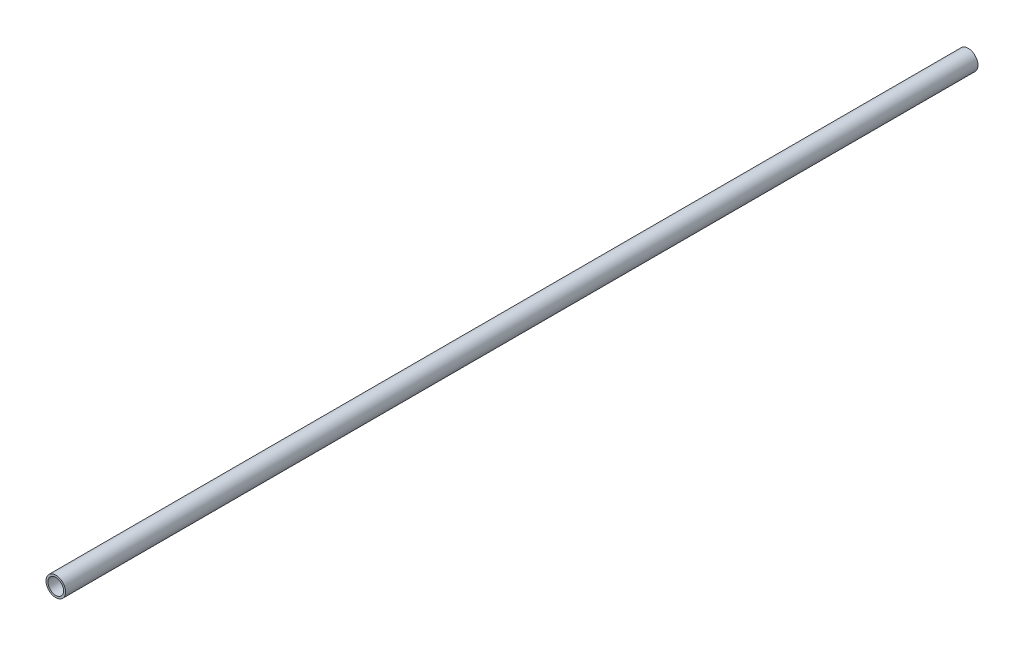
ISO-10303-21;
HEADER;
FILE_DESCRIPTION(('STEP AP214'),'2;1');
FILE_NAME('part.step','',(''),(''),'','','');
FILE_SCHEMA(('AUTOMOTIVE_DESIGN { 1 0 10303 214 1 1 1 1 }'));
ENDSEC;
DATA;
#1=APPLICATION_CONTEXT('core data for automotive mechanical design processes');
#2=APPLICATION_PROTOCOL_DEFINITION('international standard','automotive_design',2000,#1);
#3=PRODUCT_CONTEXT('',#1,'mechanical');
#4=PRODUCT('Part','Part','',(#3));
#5=PRODUCT_RELATED_PRODUCT_CATEGORY('part','',(#4));
#6=PRODUCT_DEFINITION_FORMATION('','',#4);
#7=PRODUCT_DEFINITION_CONTEXT('part definition',#1,'design');
#8=PRODUCT_DEFINITION('design','',#6,#7);
#9=PRODUCT_DEFINITION_SHAPE('','',#8);
#10=(LENGTH_UNIT() NAMED_UNIT(*) SI_UNIT(.MILLI.,.METRE.));
#11=(NAMED_UNIT(*) PLANE_ANGLE_UNIT() SI_UNIT($,.RADIAN.));
#12=(NAMED_UNIT(*) SI_UNIT($,.STERADIAN.) SOLID_ANGLE_UNIT());
#13=UNCERTAINTY_MEASURE_WITH_UNIT(LENGTH_MEASURE(1.E-05),#10,'distance_accuracy_value','');
#14=(GEOMETRIC_REPRESENTATION_CONTEXT(3) GLOBAL_UNCERTAINTY_ASSIGNED_CONTEXT((#13)) GLOBAL_UNIT_ASSIGNED_CONTEXT((#10,
#11,#12)) REPRESENTATION_CONTEXT('',''));
#15=CARTESIAN_POINT('',(0.,0.,0.));
#16=DIRECTION('',(0.,0.,1.));
#17=DIRECTION('',(1.,0.,0.));
#18=AXIS2_PLACEMENT_3D('',#15,#16,#17);
#19=CARTESIAN_POINT('',(0.,0.,1400.));
#20=DIRECTION('',(0.,0.,-1.));
#21=DIRECTION('',(-1.,0.,0.));
#22=AXIS2_PLACEMENT_3D('',#19,#20,#21);
#23=CYLINDRICAL_SURFACE('',#22,15.);
#24=CARTESIAN_POINT('',(0.,0.,1400.));
#25=DIRECTION('',(0.,0.,1.));
#26=DIRECTION('',(1.,0.,0.));
#27=AXIS2_PLACEMENT_3D('',#24,#25,#26);
#28=CIRCLE('',#27,15.);
#29=CARTESIAN_POINT('',(15.,0.,1400.));
#30=VERTEX_POINT('',#29);
#31=EDGE_CURVE('E10',#30,#30,#28,.T.);
#32=ORIENTED_EDGE('',*,*,#31,.F.);
#33=EDGE_LOOP('',(#32));
#34=FACE_BOUND('',#33,.T.);
#35=CARTESIAN_POINT('',(0.,0.,0.));
#36=DIRECTION('',(0.,0.,1.));
#37=DIRECTION('',(1.,0.,0.));
#38=AXIS2_PLACEMENT_3D('',#35,#36,#37);
#39=CIRCLE('',#38,15.);
#40=CARTESIAN_POINT('',(15.,0.,0.));
#41=VERTEX_POINT('',#40);
#42=EDGE_CURVE('E35',#41,#41,#39,.T.);
#43=ORIENTED_EDGE('',*,*,#42,.T.);
#44=EDGE_LOOP('',(#43));
#45=FACE_BOUND('',#44,.T.);
#46=ADVANCED_FACE('F32',(#34,#45),#23,.T.);
#47=CARTESIAN_POINT('',(0.,0.,1400.));
#48=DIRECTION('',(0.,0.,1.));
#49=DIRECTION('',(1.,0.,0.));
#50=AXIS2_PLACEMENT_3D('',#47,#48,#49);
#51=PLANE('',#50);
#52=CARTESIAN_POINT('',(0.,0.,1400.));
#53=DIRECTION('',(0.,0.,1.));
#54=DIRECTION('',(1.,0.,0.));
#55=AXIS2_PLACEMENT_3D('',#52,#53,#54);
#56=CIRCLE('',#55,12.);
#57=CARTESIAN_POINT('',(12.,0.,1400.));
#58=VERTEX_POINT('',#57);
#59=EDGE_CURVE('E42',#58,#58,#56,.T.);
#60=ORIENTED_EDGE('',*,*,#59,.F.);
#61=EDGE_LOOP('',(#60));
#62=FACE_BOUND('',#61,.T.);
#63=ORIENTED_EDGE('',*,*,#31,.T.);
#64=EDGE_LOOP('',(#63));
#65=FACE_BOUND('',#64,.T.);
#66=ADVANCED_FACE('F53',(#62,#65),#51,.T.);
#67=CARTESIAN_POINT('',(0.,0.,0.));
#68=DIRECTION('',(0.,0.,1.));
#69=DIRECTION('',(1.,0.,0.));
#70=AXIS2_PLACEMENT_3D('',#67,#68,#69);
#71=PLANE('',#70);
#72=CARTESIAN_POINT('',(0.,0.,0.));
#73=DIRECTION('',(0.,0.,1.));
#74=DIRECTION('',(1.,0.,0.));
#75=AXIS2_PLACEMENT_3D('',#72,#73,#74);
#76=CIRCLE('',#75,12.);
#77=CARTESIAN_POINT('',(12.,0.,0.));
#78=VERTEX_POINT('',#77);
#79=EDGE_CURVE('E44',#78,#78,#76,.T.);
#80=ORIENTED_EDGE('',*,*,#79,.T.);
#81=EDGE_LOOP('',(#80));
#82=FACE_BOUND('',#81,.T.);
#83=ORIENTED_EDGE('',*,*,#42,.F.);
#84=EDGE_LOOP('',(#83));
#85=FACE_BOUND('',#84,.T.);
#86=ADVANCED_FACE('F55',(#82,#85),#71,.F.);
#87=CARTESIAN_POINT('',(0.,0.,1400.));
#88=DIRECTION('',(0.,0.,-1.));
#89=DIRECTION('',(-1.,0.,0.));
#90=AXIS2_PLACEMENT_3D('',#87,#88,#89);
#91=CYLINDRICAL_SURFACE('',#90,12.);
#92=ORIENTED_EDGE('',*,*,#59,.T.);
#93=EDGE_LOOP('',(#92));
#94=FACE_BOUND('',#93,.T.);
#95=ORIENTED_EDGE('',*,*,#79,.F.);
#96=EDGE_LOOP('',(#95));
#97=FACE_BOUND('',#96,.T.);
#98=ADVANCED_FACE('F50',(#94,#97),#91,.F.);
#99=CLOSED_SHELL('',(#46,#66,#86,#98));
#100=MANIFOLD_SOLID_BREP('B2',#99);
#101=ADVANCED_BREP_SHAPE_REPRESENTATION('',(#18,#100),#14);
#102=SHAPE_DEFINITION_REPRESENTATION(#9,#101);
ENDSEC;
END-ISO-10303-21;
